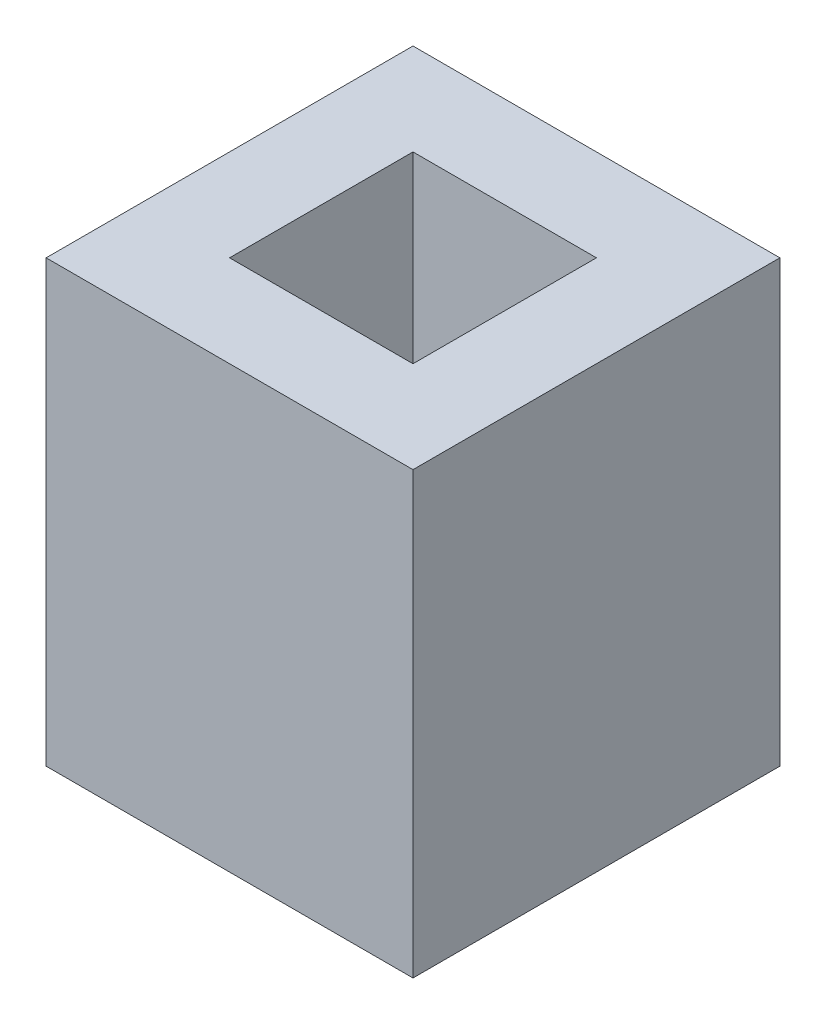
ISO-10303-21;
HEADER;
FILE_DESCRIPTION(('STEP AP214'),'2;1');
FILE_NAME('part.step','',(''),(''),'','','');
FILE_SCHEMA(('AUTOMOTIVE_DESIGN { 1 0 10303 214 1 1 1 1 }'));
ENDSEC;
DATA;
#1=APPLICATION_CONTEXT('core data for automotive mechanical design processes');
#2=APPLICATION_PROTOCOL_DEFINITION('international standard','automotive_design',2000,#1);
#3=PRODUCT_CONTEXT('',#1,'mechanical');
#4=PRODUCT('Part','Part','',(#3));
#5=PRODUCT_RELATED_PRODUCT_CATEGORY('part','',(#4));
#6=PRODUCT_DEFINITION_FORMATION('','',#4);
#7=PRODUCT_DEFINITION_CONTEXT('part definition',#1,'design');
#8=PRODUCT_DEFINITION('design','',#6,#7);
#9=PRODUCT_DEFINITION_SHAPE('','',#8);
#10=(LENGTH_UNIT() NAMED_UNIT(*) SI_UNIT(.MILLI.,.METRE.));
#11=(NAMED_UNIT(*) PLANE_ANGLE_UNIT() SI_UNIT($,.RADIAN.));
#12=(NAMED_UNIT(*) SI_UNIT($,.STERADIAN.) SOLID_ANGLE_UNIT());
#13=UNCERTAINTY_MEASURE_WITH_UNIT(LENGTH_MEASURE(1.E-05),#10,'distance_accuracy_value','');
#14=(GEOMETRIC_REPRESENTATION_CONTEXT(3) GLOBAL_UNCERTAINTY_ASSIGNED_CONTEXT((#13)) GLOBAL_UNIT_ASSIGNED_CONTEXT((#10,
#11,#12)) REPRESENTATION_CONTEXT('',''));
#15=CARTESIAN_POINT('',(0.,0.,0.));
#16=DIRECTION('',(0.,0.,1.));
#17=DIRECTION('',(1.,0.,0.));
#18=AXIS2_PLACEMENT_3D('',#15,#16,#17);
#19=CARTESIAN_POINT('',(0.,12.,0.));
#20=DIRECTION('',(0.,-1.,0.));
#21=DIRECTION('',(0.,0.,-1.));
#22=AXIS2_PLACEMENT_3D('',#19,#20,#21);
#23=PLANE('',#22);
#24=DIRECTION('',(0.,0.,1.));
#25=VECTOR('',#24,1.);
#26=CARTESIAN_POINT('',(0.,12.,0.));
#27=LINE('',#26,#25);
#28=CARTESIAN_POINT('',(0.,12.,-10.));
#29=VERTEX_POINT('',#28);
#30=CARTESIAN_POINT('',(0.,12.,0.));
#31=VERTEX_POINT('',#30);
#32=EDGE_CURVE('E136',#29,#31,#27,.T.);
#33=ORIENTED_EDGE('',*,*,#32,.T.);
#34=DIRECTION('',(1.,0.,0.));
#35=VECTOR('',#34,1.);
#36=CARTESIAN_POINT('',(0.,12.,0.));
#37=LINE('',#36,#35);
#38=CARTESIAN_POINT('',(10.,12.,0.));
#39=VERTEX_POINT('',#38);
#40=EDGE_CURVE('E139',#31,#39,#37,.T.);
#41=ORIENTED_EDGE('',*,*,#40,.T.);
#42=DIRECTION('',(0.,0.,-1.));
#43=VECTOR('',#42,1.);
#44=CARTESIAN_POINT('',(10.,12.,0.));
#45=LINE('',#44,#43);
#46=CARTESIAN_POINT('',(10.,12.,-10.));
#47=VERTEX_POINT('',#46);
#48=EDGE_CURVE('E142',#39,#47,#45,.T.);
#49=ORIENTED_EDGE('',*,*,#48,.T.);
#50=DIRECTION('',(-1.,0.,0.));
#51=VECTOR('',#50,1.);
#52=CARTESIAN_POINT('',(0.,12.,-10.));
#53=LINE('',#52,#51);
#54=EDGE_CURVE('E144',#47,#29,#53,.T.);
#55=ORIENTED_EDGE('',*,*,#54,.T.);
#56=EDGE_LOOP('',(#33,#41,#49,#55));
#57=FACE_BOUND('',#56,.T.);
#58=DIRECTION('',(0.,0.,1.));
#59=VECTOR('',#58,1.);
#60=CARTESIAN_POINT('',(2.5,12.,-7.5));
#61=LINE('',#60,#59);
#62=CARTESIAN_POINT('',(2.5,12.,-7.5));
#63=VERTEX_POINT('',#62);
#64=CARTESIAN_POINT('',(2.5,12.,-2.5));
#65=VERTEX_POINT('',#64);
#66=EDGE_CURVE('E100',#63,#65,#61,.T.);
#67=ORIENTED_EDGE('',*,*,#66,.F.);
#68=DIRECTION('',(-1.,0.,0.));
#69=VECTOR('',#68,1.);
#70=CARTESIAN_POINT('',(2.5,12.,-7.5));
#71=LINE('',#70,#69);
#72=CARTESIAN_POINT('',(7.5,12.,-7.5));
#73=VERTEX_POINT('',#72);
#74=EDGE_CURVE('E122',#73,#63,#71,.T.);
#75=ORIENTED_EDGE('',*,*,#74,.F.);
#76=DIRECTION('',(0.,0.,-1.));
#77=VECTOR('',#76,1.);
#78=CARTESIAN_POINT('',(7.5,12.,-7.5));
#79=LINE('',#78,#77);
#80=CARTESIAN_POINT('',(7.5,12.,-2.5));
#81=VERTEX_POINT('',#80);
#82=EDGE_CURVE('E120',#81,#73,#79,.T.);
#83=ORIENTED_EDGE('',*,*,#82,.F.);
#84=DIRECTION('',(1.,0.,0.));
#85=VECTOR('',#84,1.);
#86=CARTESIAN_POINT('',(2.5,12.,-2.5));
#87=LINE('',#86,#85);
#88=EDGE_CURVE('E108',#65,#81,#87,.T.);
#89=ORIENTED_EDGE('',*,*,#88,.F.);
#90=EDGE_LOOP('',(#67,#75,#83,#89));
#91=FACE_BOUND('',#90,.T.);
#92=ADVANCED_FACE('F35',(#57,#91),#23,.F.);
#93=CARTESIAN_POINT('',(0.,0.,0.));
#94=DIRECTION('',(0.,-1.,0.));
#95=DIRECTION('',(0.,0.,-1.));
#96=AXIS2_PLACEMENT_3D('',#93,#94,#95);
#97=PLANE('',#96);
#98=DIRECTION('',(0.,0.,1.));
#99=VECTOR('',#98,1.);
#100=CARTESIAN_POINT('',(0.,0.,0.));
#101=LINE('',#100,#99);
#102=CARTESIAN_POINT('',(0.,0.,-10.));
#103=VERTEX_POINT('',#102);
#104=CARTESIAN_POINT('',(0.,0.,0.));
#105=VERTEX_POINT('',#104);
#106=EDGE_CURVE('E116',#103,#105,#101,.T.);
#107=ORIENTED_EDGE('',*,*,#106,.F.);
#108=DIRECTION('',(-1.,0.,0.));
#109=VECTOR('',#108,1.);
#110=CARTESIAN_POINT('',(0.,0.,-10.));
#111=LINE('',#110,#109);
#112=CARTESIAN_POINT('',(10.,0.,-10.));
#113=VERTEX_POINT('',#112);
#114=EDGE_CURVE('E140',#113,#103,#111,.T.);
#115=ORIENTED_EDGE('',*,*,#114,.F.);
#116=DIRECTION('',(0.,0.,-1.));
#117=VECTOR('',#116,1.);
#118=CARTESIAN_POINT('',(10.,0.,0.));
#119=LINE('',#118,#117);
#120=CARTESIAN_POINT('',(10.,0.,0.));
#121=VERTEX_POINT('',#120);
#122=EDGE_CURVE('E151',#121,#113,#119,.T.);
#123=ORIENTED_EDGE('',*,*,#122,.F.);
#124=DIRECTION('',(1.,0.,0.));
#125=VECTOR('',#124,1.);
#126=CARTESIAN_POINT('',(0.,0.,0.));
#127=LINE('',#126,#125);
#128=EDGE_CURVE('E149',#105,#121,#127,.T.);
#129=ORIENTED_EDGE('',*,*,#128,.F.);
#130=EDGE_LOOP('',(#107,#115,#123,#129));
#131=FACE_BOUND('',#130,.T.);
#132=DIRECTION('',(-1.,0.,0.));
#133=VECTOR('',#132,1.);
#134=CARTESIAN_POINT('',(2.5,0.,-7.5));
#135=LINE('',#134,#133);
#136=CARTESIAN_POINT('',(7.5,0.,-7.5));
#137=VERTEX_POINT('',#136);
#138=CARTESIAN_POINT('',(2.5,0.,-7.5));
#139=VERTEX_POINT('',#138);
#140=EDGE_CURVE('E109',#137,#139,#135,.T.);
#141=ORIENTED_EDGE('',*,*,#140,.T.);
#142=DIRECTION('',(0.,0.,1.));
#143=VECTOR('',#142,1.);
#144=CARTESIAN_POINT('',(2.5,0.,-7.5));
#145=LINE('',#144,#143);
#146=CARTESIAN_POINT('',(2.5,0.,-2.5));
#147=VERTEX_POINT('',#146);
#148=EDGE_CURVE('E58',#139,#147,#145,.T.);
#149=ORIENTED_EDGE('',*,*,#148,.T.);
#150=DIRECTION('',(1.,0.,0.));
#151=VECTOR('',#150,1.);
#152=CARTESIAN_POINT('',(2.5,0.,-2.5));
#153=LINE('',#152,#151);
#154=CARTESIAN_POINT('',(7.5,0.,-2.5));
#155=VERTEX_POINT('',#154);
#156=EDGE_CURVE('E115',#147,#155,#153,.T.);
#157=ORIENTED_EDGE('',*,*,#156,.T.);
#158=DIRECTION('',(0.,0.,-1.));
#159=VECTOR('',#158,1.);
#160=CARTESIAN_POINT('',(7.5,0.,-7.5));
#161=LINE('',#160,#159);
#162=EDGE_CURVE('E128',#155,#137,#161,.T.);
#163=ORIENTED_EDGE('',*,*,#162,.T.);
#164=EDGE_LOOP('',(#141,#149,#157,#163));
#165=FACE_BOUND('',#164,.T.);
#166=ADVANCED_FACE('F169',(#131,#165),#97,.T.);
#167=CARTESIAN_POINT('',(0.,12.,0.));
#168=DIRECTION('',(1.,0.,0.));
#169=DIRECTION('',(0.,0.,-1.));
#170=AXIS2_PLACEMENT_3D('',#167,#168,#169);
#171=PLANE('',#170);
#172=ORIENTED_EDGE('',*,*,#106,.T.);
#173=DIRECTION('',(0.,-1.,0.));
#174=VECTOR('',#173,1.);
#175=CARTESIAN_POINT('',(0.,12.,0.));
#176=LINE('',#175,#174);
#177=EDGE_CURVE('E11',#31,#105,#176,.T.);
#178=ORIENTED_EDGE('',*,*,#177,.F.);
#179=ORIENTED_EDGE('',*,*,#32,.F.);
#180=DIRECTION('',(0.,-1.,0.));
#181=VECTOR('',#180,1.);
#182=CARTESIAN_POINT('',(0.,12.,-10.));
#183=LINE('',#182,#181);
#184=EDGE_CURVE('E146',#29,#103,#183,.T.);
#185=ORIENTED_EDGE('',*,*,#184,.T.);
#186=EDGE_LOOP('',(#172,#178,#179,#185));
#187=FACE_BOUND('',#186,.T.);
#188=ADVANCED_FACE('F37',(#187),#171,.F.);
#189=CARTESIAN_POINT('',(0.,12.,0.));
#190=DIRECTION('',(0.,0.,-1.));
#191=DIRECTION('',(-1.,0.,0.));
#192=AXIS2_PLACEMENT_3D('',#189,#190,#191);
#193=PLANE('',#192);
#194=ORIENTED_EDGE('',*,*,#128,.T.);
#195=DIRECTION('',(0.,-1.,0.));
#196=VECTOR('',#195,1.);
#197=CARTESIAN_POINT('',(10.,12.,0.));
#198=LINE('',#197,#196);
#199=EDGE_CURVE('E43',#39,#121,#198,.T.);
#200=ORIENTED_EDGE('',*,*,#199,.F.);
#201=ORIENTED_EDGE('',*,*,#40,.F.);
#202=ORIENTED_EDGE('',*,*,#177,.T.);
#203=EDGE_LOOP('',(#194,#200,#201,#202));
#204=FACE_BOUND('',#203,.T.);
#205=ADVANCED_FACE('F179',(#204),#193,.F.);
#206=CARTESIAN_POINT('',(10.,12.,0.));
#207=DIRECTION('',(-1.,0.,0.));
#208=DIRECTION('',(0.,0.,1.));
#209=AXIS2_PLACEMENT_3D('',#206,#207,#208);
#210=PLANE('',#209);
#211=ORIENTED_EDGE('',*,*,#122,.T.);
#212=DIRECTION('',(0.,-1.,0.));
#213=VECTOR('',#212,1.);
#214=CARTESIAN_POINT('',(10.,12.,-10.));
#215=LINE('',#214,#213);
#216=EDGE_CURVE('E156',#47,#113,#215,.T.);
#217=ORIENTED_EDGE('',*,*,#216,.F.);
#218=ORIENTED_EDGE('',*,*,#48,.F.);
#219=ORIENTED_EDGE('',*,*,#199,.T.);
#220=EDGE_LOOP('',(#211,#217,#218,#219));
#221=FACE_BOUND('',#220,.T.);
#222=ADVANCED_FACE('F163',(#221),#210,.F.);
#223=CARTESIAN_POINT('',(0.,12.,-10.));
#224=DIRECTION('',(0.,0.,1.));
#225=DIRECTION('',(1.,0.,0.));
#226=AXIS2_PLACEMENT_3D('',#223,#224,#225);
#227=PLANE('',#226);
#228=ORIENTED_EDGE('',*,*,#114,.T.);
#229=ORIENTED_EDGE('',*,*,#184,.F.);
#230=ORIENTED_EDGE('',*,*,#54,.F.);
#231=ORIENTED_EDGE('',*,*,#216,.T.);
#232=EDGE_LOOP('',(#228,#229,#230,#231));
#233=FACE_BOUND('',#232,.T.);
#234=ADVANCED_FACE('F173',(#233),#227,.F.);
#235=CARTESIAN_POINT('',(2.5,12.,-7.5));
#236=DIRECTION('',(1.,0.,0.));
#237=DIRECTION('',(0.,0.,-1.));
#238=AXIS2_PLACEMENT_3D('',#235,#236,#237);
#239=PLANE('',#238);
#240=ORIENTED_EDGE('',*,*,#148,.F.);
#241=DIRECTION('',(0.,-1.,0.));
#242=VECTOR('',#241,1.);
#243=CARTESIAN_POINT('',(2.5,12.,-7.5));
#244=LINE('',#243,#242);
#245=EDGE_CURVE('E104',#63,#139,#244,.T.);
#246=ORIENTED_EDGE('',*,*,#245,.F.);
#247=ORIENTED_EDGE('',*,*,#66,.T.);
#248=DIRECTION('',(0.,-1.,0.));
#249=VECTOR('',#248,1.);
#250=CARTESIAN_POINT('',(2.5,12.,-2.5));
#251=LINE('',#250,#249);
#252=EDGE_CURVE('E103',#65,#147,#251,.T.);
#253=ORIENTED_EDGE('',*,*,#252,.T.);
#254=EDGE_LOOP('',(#240,#246,#247,#253));
#255=FACE_BOUND('',#254,.T.);
#256=ADVANCED_FACE('F102',(#255),#239,.T.);
#257=CARTESIAN_POINT('',(2.5,12.,-2.5));
#258=DIRECTION('',(0.,0.,-1.));
#259=DIRECTION('',(-1.,0.,0.));
#260=AXIS2_PLACEMENT_3D('',#257,#258,#259);
#261=PLANE('',#260);
#262=ORIENTED_EDGE('',*,*,#156,.F.);
#263=ORIENTED_EDGE('',*,*,#252,.F.);
#264=ORIENTED_EDGE('',*,*,#88,.T.);
#265=DIRECTION('',(0.,-1.,0.));
#266=VECTOR('',#265,1.);
#267=CARTESIAN_POINT('',(7.5,12.,-2.5));
#268=LINE('',#267,#266);
#269=EDGE_CURVE('E117',#81,#155,#268,.T.);
#270=ORIENTED_EDGE('',*,*,#269,.T.);
#271=EDGE_LOOP('',(#262,#263,#264,#270));
#272=FACE_BOUND('',#271,.T.);
#273=ADVANCED_FACE('F112',(#272),#261,.T.);
#274=CARTESIAN_POINT('',(7.5,12.,-7.5));
#275=DIRECTION('',(-1.,0.,0.));
#276=DIRECTION('',(0.,0.,1.));
#277=AXIS2_PLACEMENT_3D('',#274,#275,#276);
#278=PLANE('',#277);
#279=ORIENTED_EDGE('',*,*,#162,.F.);
#280=ORIENTED_EDGE('',*,*,#269,.F.);
#281=ORIENTED_EDGE('',*,*,#82,.T.);
#282=DIRECTION('',(0.,-1.,0.));
#283=VECTOR('',#282,1.);
#284=CARTESIAN_POINT('',(7.5,12.,-7.5));
#285=LINE('',#284,#283);
#286=EDGE_CURVE('E50',#73,#137,#285,.T.);
#287=ORIENTED_EDGE('',*,*,#286,.T.);
#288=EDGE_LOOP('',(#279,#280,#281,#287));
#289=FACE_BOUND('',#288,.T.);
#290=ADVANCED_FACE('F202',(#289),#278,.T.);
#291=CARTESIAN_POINT('',(2.5,12.,-7.5));
#292=DIRECTION('',(0.,0.,1.));
#293=DIRECTION('',(1.,0.,0.));
#294=AXIS2_PLACEMENT_3D('',#291,#292,#293);
#295=PLANE('',#294);
#296=ORIENTED_EDGE('',*,*,#140,.F.);
#297=ORIENTED_EDGE('',*,*,#286,.F.);
#298=ORIENTED_EDGE('',*,*,#74,.T.);
#299=ORIENTED_EDGE('',*,*,#245,.T.);
#300=EDGE_LOOP('',(#296,#297,#298,#299));
#301=FACE_BOUND('',#300,.T.);
#302=ADVANCED_FACE('F206',(#301),#295,.T.);
#303=CLOSED_SHELL('',(#92,#166,#188,#205,#222,#234,#256,#273,#290,#302));
#304=MANIFOLD_SOLID_BREP('B2',#303);
#305=ADVANCED_BREP_SHAPE_REPRESENTATION('',(#18,#304),#14);
#306=SHAPE_DEFINITION_REPRESENTATION(#9,#305);
ENDSEC;
END-ISO-10303-21;
